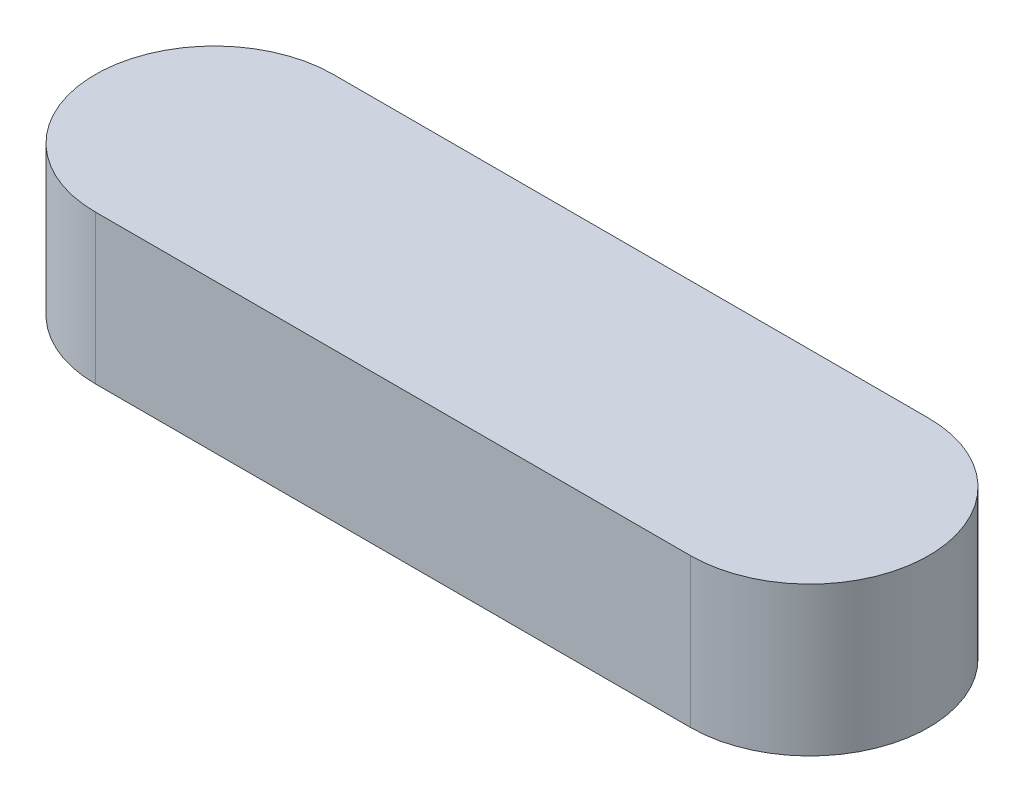
ISO-10303-21;
HEADER;
FILE_DESCRIPTION(('STEP AP214'),'2;1');
FILE_NAME('part.step','',(''),(''),'','','');
FILE_SCHEMA(('AUTOMOTIVE_DESIGN { 1 0 10303 214 1 1 1 1 }'));
ENDSEC;
DATA;
#1=APPLICATION_CONTEXT('core data for automotive mechanical design processes');
#2=APPLICATION_PROTOCOL_DEFINITION('international standard','automotive_design',2000,#1);
#3=PRODUCT_CONTEXT('',#1,'mechanical');
#4=PRODUCT('Part','Part','',(#3));
#5=PRODUCT_RELATED_PRODUCT_CATEGORY('part','',(#4));
#6=PRODUCT_DEFINITION_FORMATION('','',#4);
#7=PRODUCT_DEFINITION_CONTEXT('part definition',#1,'design');
#8=PRODUCT_DEFINITION('design','',#6,#7);
#9=PRODUCT_DEFINITION_SHAPE('','',#8);
#10=(LENGTH_UNIT() NAMED_UNIT(*) SI_UNIT(.MILLI.,.METRE.));
#11=(NAMED_UNIT(*) PLANE_ANGLE_UNIT() SI_UNIT($,.RADIAN.));
#12=(NAMED_UNIT(*) SI_UNIT($,.STERADIAN.) SOLID_ANGLE_UNIT());
#13=UNCERTAINTY_MEASURE_WITH_UNIT(LENGTH_MEASURE(1.E-05),#10,'distance_accuracy_value','');
#14=(GEOMETRIC_REPRESENTATION_CONTEXT(3) GLOBAL_UNCERTAINTY_ASSIGNED_CONTEXT((#13)) GLOBAL_UNIT_ASSIGNED_CONTEXT((#10,
#11,#12)) REPRESENTATION_CONTEXT('',''));
#15=CARTESIAN_POINT('',(0.,0.,0.));
#16=DIRECTION('',(0.,0.,1.));
#17=DIRECTION('',(1.,0.,0.));
#18=AXIS2_PLACEMENT_3D('',#15,#16,#17);
#19=CARTESIAN_POINT('',(-20.0000000000001,68.2408791142442,0.));
#20=DIRECTION('',(0.,-1.,0.));
#21=DIRECTION('',(0.,0.,-1.));
#22=AXIS2_PLACEMENT_3D('',#19,#20,#21);
#23=CYLINDRICAL_SURFACE('',#22,8.);
#24=CARTESIAN_POINT('',(-20.0000000000001,9.99999999999999,0.));
#25=DIRECTION('',(0.,1.,0.));
#26=DIRECTION('',(0.,0.,1.));
#27=AXIS2_PLACEMENT_3D('',#24,#25,#26);
#28=CIRCLE('',#27,8.);
#29=CARTESIAN_POINT('',(-20.0000000000001,9.99999999999999,-8.));
#30=VERTEX_POINT('',#29);
#31=CARTESIAN_POINT('',(-20.0000000000001,9.99999999999999,8.));
#32=VERTEX_POINT('',#31);
#33=EDGE_CURVE('E93',#30,#32,#28,.T.);
#34=ORIENTED_EDGE('',*,*,#33,.F.);
#35=DIRECTION('',(0.,-1.,0.));
#36=VECTOR('',#35,1.);
#37=CARTESIAN_POINT('',(-20.0000000000001,68.2408791142442,-8.));
#38=LINE('',#37,#36);
#39=CARTESIAN_POINT('',(-20.0000000000001,0.,-8.));
#40=VERTEX_POINT('',#39);
#41=EDGE_CURVE('E47',#30,#40,#38,.T.);
#42=ORIENTED_EDGE('',*,*,#41,.T.);
#43=CARTESIAN_POINT('',(-20.0000000000001,0.,0.));
#44=DIRECTION('',(0.,1.,0.));
#45=DIRECTION('',(0.,0.,1.));
#46=AXIS2_PLACEMENT_3D('',#43,#44,#45);
#47=CIRCLE('',#46,8.);
#48=CARTESIAN_POINT('',(-20.0000000000001,0.,8.));
#49=VERTEX_POINT('',#48);
#50=EDGE_CURVE('E91',#40,#49,#47,.T.);
#51=ORIENTED_EDGE('',*,*,#50,.T.);
#52=DIRECTION('',(0.,-1.,0.));
#53=VECTOR('',#52,1.);
#54=CARTESIAN_POINT('',(-20.0000000000001,68.2408791142442,8.));
#55=LINE('',#54,#53);
#56=EDGE_CURVE('E82',#32,#49,#55,.T.);
#57=ORIENTED_EDGE('',*,*,#56,.F.);
#58=EDGE_LOOP('',(#34,#42,#51,#57));
#59=FACE_BOUND('',#58,.T.);
#60=ADVANCED_FACE('F43',(#59),#23,.T.);
#61=CARTESIAN_POINT('',(-20.0000000000001,68.2408791142442,8.));
#62=DIRECTION('',(0.,0.,-1.));
#63=DIRECTION('',(-1.,0.,0.));
#64=AXIS2_PLACEMENT_3D('',#61,#62,#63);
#65=PLANE('',#64);
#66=DIRECTION('',(1.,0.,0.));
#67=VECTOR('',#66,1.);
#68=CARTESIAN_POINT('',(-20.0000000000001,9.99999999999999,8.));
#69=LINE('',#68,#67);
#70=CARTESIAN_POINT('',(20.,10.,8.00000000000001));
#71=VERTEX_POINT('',#70);
#72=EDGE_CURVE('E52',#32,#71,#69,.T.);
#73=ORIENTED_EDGE('',*,*,#72,.F.);
#74=ORIENTED_EDGE('',*,*,#56,.T.);
#75=DIRECTION('',(1.,0.,0.));
#76=VECTOR('',#75,1.);
#77=CARTESIAN_POINT('',(-20.0000000000001,0.,8.));
#78=LINE('',#77,#76);
#79=CARTESIAN_POINT('',(20.,0.,8.00000000000001));
#80=VERTEX_POINT('',#79);
#81=EDGE_CURVE('E103',#49,#80,#78,.T.);
#82=ORIENTED_EDGE('',*,*,#81,.T.);
#83=DIRECTION('',(0.,-1.,0.));
#84=VECTOR('',#83,1.);
#85=CARTESIAN_POINT('',(20.,68.2408791142442,8.));
#86=LINE('',#85,#84);
#87=EDGE_CURVE('E112',#71,#80,#86,.T.);
#88=ORIENTED_EDGE('',*,*,#87,.F.);
#89=EDGE_LOOP('',(#73,#74,#82,#88));
#90=FACE_BOUND('',#89,.T.);
#91=ADVANCED_FACE('F116',(#90),#65,.F.);
#92=CARTESIAN_POINT('',(20.,68.2408791142442,0.));
#93=DIRECTION('',(0.,-1.,0.));
#94=DIRECTION('',(0.,0.,-1.));
#95=AXIS2_PLACEMENT_3D('',#92,#93,#94);
#96=CYLINDRICAL_SURFACE('',#95,8.);
#97=CARTESIAN_POINT('',(20.,10.,0.));
#98=DIRECTION('',(0.,1.,0.));
#99=DIRECTION('',(0.,0.,1.));
#100=AXIS2_PLACEMENT_3D('',#97,#98,#99);
#101=CIRCLE('',#100,8.);
#102=CARTESIAN_POINT('',(20.,10.,-8.00000000000001));
#103=VERTEX_POINT('',#102);
#104=EDGE_CURVE('E13',#71,#103,#101,.T.);
#105=ORIENTED_EDGE('',*,*,#104,.F.);
#106=ORIENTED_EDGE('',*,*,#87,.T.);
#107=CARTESIAN_POINT('',(20.,0.,0.));
#108=DIRECTION('',(0.,1.,0.));
#109=DIRECTION('',(0.,0.,1.));
#110=AXIS2_PLACEMENT_3D('',#107,#108,#109);
#111=CIRCLE('',#110,8.);
#112=CARTESIAN_POINT('',(20.,0.,-8.00000000000001));
#113=VERTEX_POINT('',#112);
#114=EDGE_CURVE('E113',#80,#113,#111,.T.);
#115=ORIENTED_EDGE('',*,*,#114,.T.);
#116=DIRECTION('',(0.,-1.,0.));
#117=VECTOR('',#116,1.);
#118=CARTESIAN_POINT('',(20.,68.2408791142442,-8.00000000000008));
#119=LINE('',#118,#117);
#120=EDGE_CURVE('E65',#103,#113,#119,.T.);
#121=ORIENTED_EDGE('',*,*,#120,.F.);
#122=EDGE_LOOP('',(#105,#106,#115,#121));
#123=FACE_BOUND('',#122,.T.);
#124=ADVANCED_FACE('F115',(#123),#96,.T.);
#125=CARTESIAN_POINT('',(20.,68.2408791142442,-8.00000000000008));
#126=DIRECTION('',(0.,0.,1.));
#127=DIRECTION('',(1.,0.,0.));
#128=AXIS2_PLACEMENT_3D('',#125,#126,#127);
#129=PLANE('',#128);
#130=DIRECTION('',(-1.,0.,0.));
#131=VECTOR('',#130,1.);
#132=CARTESIAN_POINT('',(20.,10.,-8.00000000000001));
#133=LINE('',#132,#131);
#134=EDGE_CURVE('E100',#103,#30,#133,.T.);
#135=ORIENTED_EDGE('',*,*,#134,.F.);
#136=ORIENTED_EDGE('',*,*,#120,.T.);
#137=DIRECTION('',(-1.,0.,0.));
#138=VECTOR('',#137,1.);
#139=CARTESIAN_POINT('',(20.,0.,-8.00000000000001));
#140=LINE('',#139,#138);
#141=EDGE_CURVE('E96',#113,#40,#140,.T.);
#142=ORIENTED_EDGE('',*,*,#141,.T.);
#143=ORIENTED_EDGE('',*,*,#41,.F.);
#144=EDGE_LOOP('',(#135,#136,#142,#143));
#145=FACE_BOUND('',#144,.T.);
#146=ADVANCED_FACE('F97',(#145),#129,.F.);
#147=CARTESIAN_POINT('',(-20.0000000000001,0.,0.));
#148=DIRECTION('',(0.,1.,0.));
#149=DIRECTION('',(0.,0.,1.));
#150=AXIS2_PLACEMENT_3D('',#147,#148,#149);
#151=PLANE('',#150);
#152=ORIENTED_EDGE('',*,*,#50,.F.);
#153=ORIENTED_EDGE('',*,*,#141,.F.);
#154=ORIENTED_EDGE('',*,*,#114,.F.);
#155=ORIENTED_EDGE('',*,*,#81,.F.);
#156=EDGE_LOOP('',(#152,#153,#154,#155));
#157=FACE_BOUND('',#156,.T.);
#158=ADVANCED_FACE('F102',(#157),#151,.F.);
#159=CARTESIAN_POINT('',(0.,9.99999999999999,0.));
#160=DIRECTION('',(0.,1.,0.));
#161=DIRECTION('',(0.,0.,1.));
#162=AXIS2_PLACEMENT_3D('',#159,#160,#161);
#163=PLANE('',#162);
#164=ORIENTED_EDGE('',*,*,#134,.T.);
#165=ORIENTED_EDGE('',*,*,#33,.T.);
#166=ORIENTED_EDGE('',*,*,#72,.T.);
#167=ORIENTED_EDGE('',*,*,#104,.T.);
#168=EDGE_LOOP('',(#164,#165,#166,#167));
#169=FACE_BOUND('',#168,.T.);
#170=ADVANCED_FACE('F45',(#169),#163,.T.);
#171=CLOSED_SHELL('',(#60,#91,#124,#146,#158,#170));
#172=MANIFOLD_SOLID_BREP('B2',#171);
#173=ADVANCED_BREP_SHAPE_REPRESENTATION('',(#18,#172),#14);
#174=SHAPE_DEFINITION_REPRESENTATION(#9,#173);
ENDSEC;
END-ISO-10303-21;
